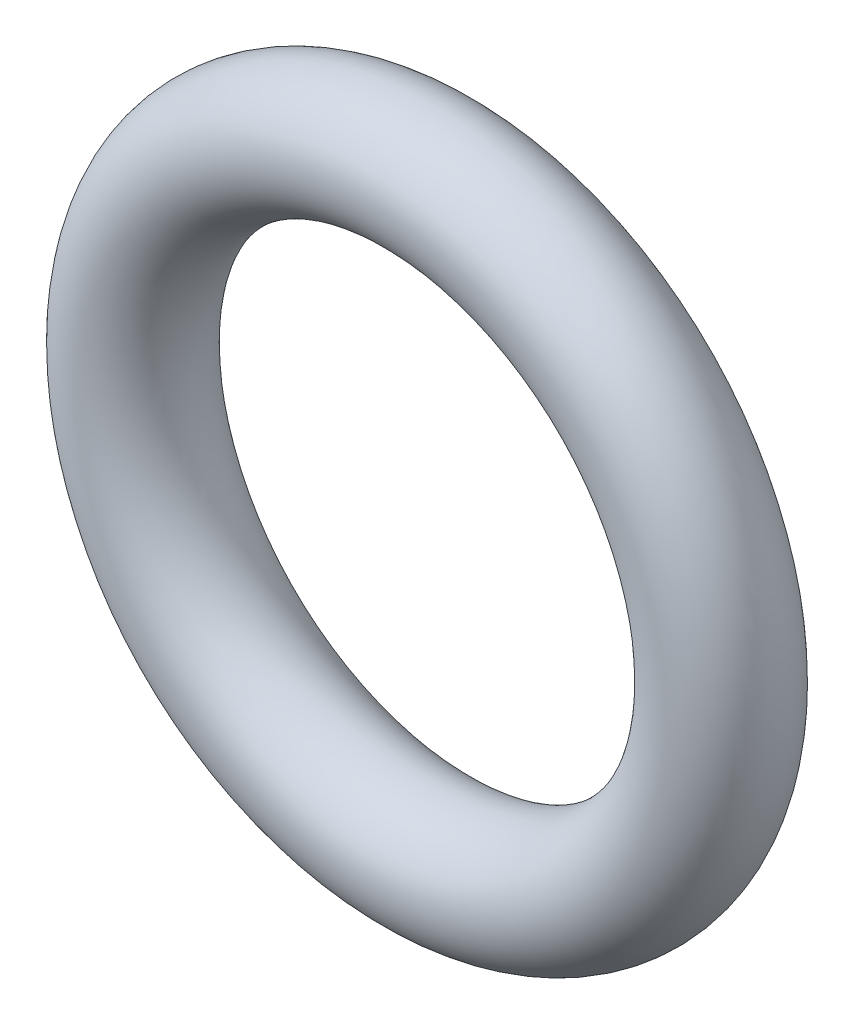
ISO-10303-21;
HEADER;
FILE_DESCRIPTION(('STEP AP214'),'2;1');
FILE_NAME('part.step','',(''),(''),'','','');
FILE_SCHEMA(('AUTOMOTIVE_DESIGN { 1 0 10303 214 1 1 1 1 }'));
ENDSEC;
DATA;
#1=APPLICATION_CONTEXT('core data for automotive mechanical design processes');
#2=APPLICATION_PROTOCOL_DEFINITION('international standard','automotive_design',2000,#1);
#3=PRODUCT_CONTEXT('',#1,'mechanical');
#4=PRODUCT('Part','Part','',(#3));
#5=PRODUCT_RELATED_PRODUCT_CATEGORY('part','',(#4));
#6=PRODUCT_DEFINITION_FORMATION('','',#4);
#7=PRODUCT_DEFINITION_CONTEXT('part definition',#1,'design');
#8=PRODUCT_DEFINITION('design','',#6,#7);
#9=PRODUCT_DEFINITION_SHAPE('','',#8);
#10=(LENGTH_UNIT() NAMED_UNIT(*) SI_UNIT(.MILLI.,.METRE.));
#11=(NAMED_UNIT(*) PLANE_ANGLE_UNIT() SI_UNIT($,.RADIAN.));
#12=(NAMED_UNIT(*) SI_UNIT($,.STERADIAN.) SOLID_ANGLE_UNIT());
#13=UNCERTAINTY_MEASURE_WITH_UNIT(LENGTH_MEASURE(1.E-05),#10,'distance_accuracy_value','');
#14=(GEOMETRIC_REPRESENTATION_CONTEXT(3) GLOBAL_UNCERTAINTY_ASSIGNED_CONTEXT((#13)) GLOBAL_UNIT_ASSIGNED_CONTEXT((#10,
#11,#12)) REPRESENTATION_CONTEXT('',''));
#15=CARTESIAN_POINT('',(0.,0.,0.));
#16=DIRECTION('',(0.,0.,1.));
#17=DIRECTION('',(1.,0.,0.));
#18=AXIS2_PLACEMENT_3D('',#15,#16,#17);
#19=CARTESIAN_POINT('',(0.,0.,0.));
#20=DIRECTION('',(0.,0.,-1.));
#21=DIRECTION('',(-1.,0.,0.));
#22=AXIS2_PLACEMENT_3D('',#19,#20,#21);
#23=TOROIDAL_SURFACE('',#22,3.85,0.8);
#24=CARTESIAN_POINT('',(-4.65,0.,0.));
#25=VERTEX_POINT('',#24);
#26=VERTEX_LOOP('',#25);
#27=FACE_BOUND('',#26,.T.);
#28=ADVANCED_FACE('F28',(#27),#23,.T.);
#29=CLOSED_SHELL('',(#28));
#30=MANIFOLD_SOLID_BREP('B2',#29);
#31=ADVANCED_BREP_SHAPE_REPRESENTATION('',(#18,#30),#14);
#32=SHAPE_DEFINITION_REPRESENTATION(#9,#31);
ENDSEC;
END-ISO-10303-21;
